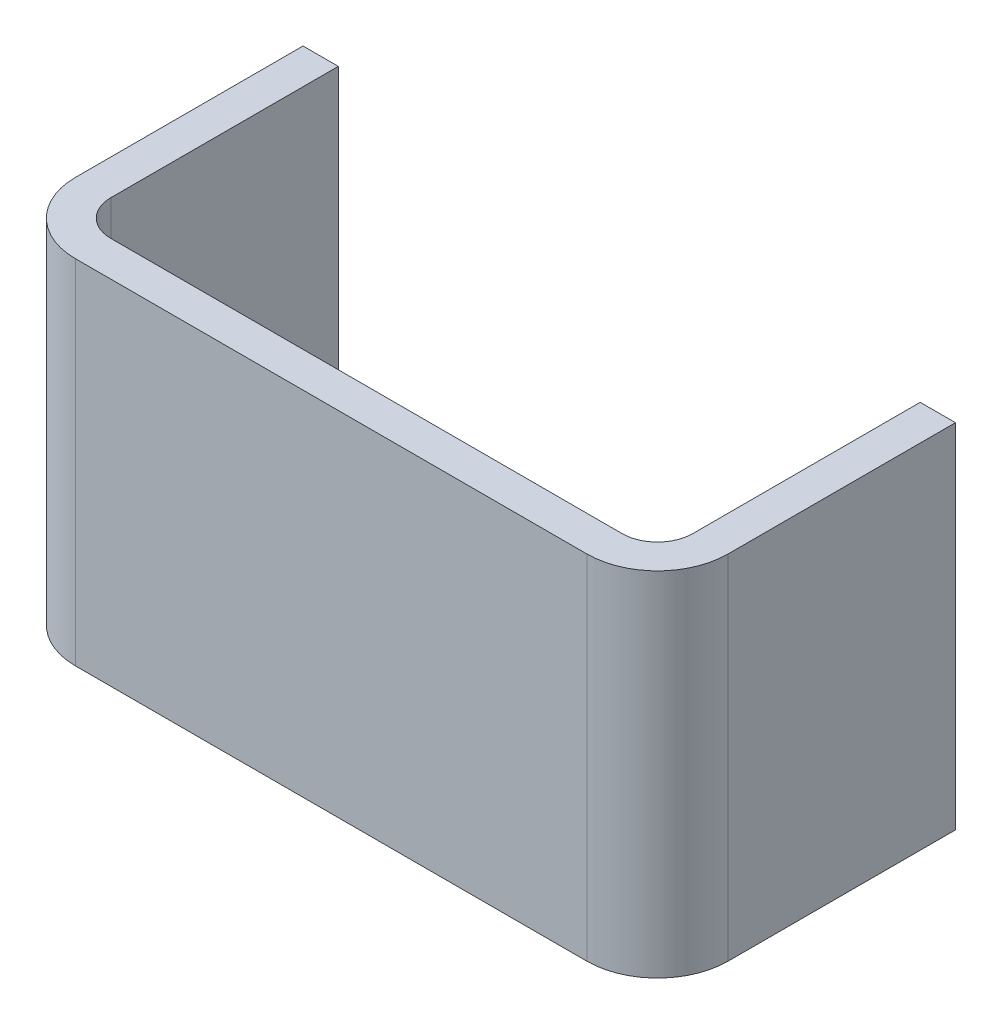
ISO-10303-21;
HEADER;
FILE_DESCRIPTION(('STEP AP214'),'2;1');
FILE_NAME('part.step','',(''),(''),'','','');
FILE_SCHEMA(('AUTOMOTIVE_DESIGN { 1 0 10303 214 1 1 1 1 }'));
ENDSEC;
DATA;
#1=APPLICATION_CONTEXT('core data for automotive mechanical design processes');
#2=APPLICATION_PROTOCOL_DEFINITION('international standard','automotive_design',2000,#1);
#3=PRODUCT_CONTEXT('',#1,'mechanical');
#4=PRODUCT('Part','Part','',(#3));
#5=PRODUCT_RELATED_PRODUCT_CATEGORY('part','',(#4));
#6=PRODUCT_DEFINITION_FORMATION('','',#4);
#7=PRODUCT_DEFINITION_CONTEXT('part definition',#1,'design');
#8=PRODUCT_DEFINITION('design','',#6,#7);
#9=PRODUCT_DEFINITION_SHAPE('','',#8);
#10=(LENGTH_UNIT() NAMED_UNIT(*) SI_UNIT(.MILLI.,.METRE.));
#11=(NAMED_UNIT(*) PLANE_ANGLE_UNIT() SI_UNIT($,.RADIAN.));
#12=(NAMED_UNIT(*) SI_UNIT($,.STERADIAN.) SOLID_ANGLE_UNIT());
#13=UNCERTAINTY_MEASURE_WITH_UNIT(LENGTH_MEASURE(1.E-05),#10,'distance_accuracy_value','');
#14=(GEOMETRIC_REPRESENTATION_CONTEXT(3) GLOBAL_UNCERTAINTY_ASSIGNED_CONTEXT((#13)) GLOBAL_UNIT_ASSIGNED_CONTEXT((#10,
#11,#12)) REPRESENTATION_CONTEXT('',''));
#15=CARTESIAN_POINT('',(0.,0.,0.));
#16=DIRECTION('',(0.,0.,1.));
#17=DIRECTION('',(1.,0.,0.));
#18=AXIS2_PLACEMENT_3D('',#15,#16,#17);
#19=CARTESIAN_POINT('',(1.36644495966095,20.,14.3944607713078));
#20=DIRECTION('',(0.,0.,1.));
#21=DIRECTION('',(1.,0.,0.));
#22=AXIS2_PLACEMENT_3D('',#19,#20,#21);
#23=PLANE('',#22);
#24=DIRECTION('',(-1.,0.,0.));
#25=VECTOR('',#24,1.);
#26=CARTESIAN_POINT('',(1.36644495966095,0.,14.3944607713078));
#27=LINE('',#26,#25);
#28=CARTESIAN_POINT('',(15.3664449596609,0.,14.3944607713078));
#29=VERTEX_POINT('',#28);
#30=CARTESIAN_POINT('',(-13.633555040339,0.,14.3944607713078));
#31=VERTEX_POINT('',#30);
#32=EDGE_CURVE('E103',#29,#31,#27,.T.);
#33=ORIENTED_EDGE('',*,*,#32,.T.);
#34=DIRECTION('',(0.,-1.,0.));
#35=VECTOR('',#34,1.);
#36=CARTESIAN_POINT('',(-13.633555040339,20.,14.3944607713078));
#37=LINE('',#36,#35);
#38=CARTESIAN_POINT('',(-13.633555040339,20.,14.3944607713078));
#39=VERTEX_POINT('',#38);
#40=EDGE_CURVE('E11',#39,#31,#37,.T.);
#41=ORIENTED_EDGE('',*,*,#40,.F.);
#42=DIRECTION('',(-1.,0.,0.));
#43=VECTOR('',#42,1.);
#44=CARTESIAN_POINT('',(1.36644495966095,20.,14.3944607713078));
#45=LINE('',#44,#43);
#46=CARTESIAN_POINT('',(15.3664449596609,20.,14.3944607713078));
#47=VERTEX_POINT('',#46);
#48=EDGE_CURVE('E109',#47,#39,#45,.T.);
#49=ORIENTED_EDGE('',*,*,#48,.F.);
#50=DIRECTION('',(0.,-1.,0.));
#51=VECTOR('',#50,1.);
#52=CARTESIAN_POINT('',(15.3664449596609,20.,14.3944607713078));
#53=LINE('',#52,#51);
#54=EDGE_CURVE('E155',#47,#29,#53,.T.);
#55=ORIENTED_EDGE('',*,*,#54,.T.);
#56=EDGE_LOOP('',(#33,#41,#49,#55));
#57=FACE_BOUND('',#56,.T.);
#58=ADVANCED_FACE('F39',(#57),#23,.F.);
#59=CARTESIAN_POINT('',(-13.6335550403391,20.,12.3944607713078));
#60=DIRECTION('',(0.,-1.,0.));
#61=DIRECTION('',(0.,0.,-1.));
#62=AXIS2_PLACEMENT_3D('',#59,#60,#61);
#63=CYLINDRICAL_SURFACE('',#62,2.);
#64=CARTESIAN_POINT('',(-13.6335550403391,0.,12.3944607713078));
#65=DIRECTION('',(0.,-1.,0.));
#66=DIRECTION('',(0.,0.,-1.));
#67=AXIS2_PLACEMENT_3D('',#64,#65,#66);
#68=CIRCLE('',#67,2.);
#69=CARTESIAN_POINT('',(-15.6335550403391,0.,12.3944607713078));
#70=VERTEX_POINT('',#69);
#71=EDGE_CURVE('E160',#31,#70,#68,.T.);
#72=ORIENTED_EDGE('',*,*,#71,.T.);
#73=DIRECTION('',(0.,-1.,0.));
#74=VECTOR('',#73,1.);
#75=CARTESIAN_POINT('',(-15.6335550403391,20.,12.3944607713078));
#76=LINE('',#75,#74);
#77=CARTESIAN_POINT('',(-15.6335550403391,20.,12.3944607713078));
#78=VERTEX_POINT('',#77);
#79=EDGE_CURVE('E47',#78,#70,#76,.T.);
#80=ORIENTED_EDGE('',*,*,#79,.F.);
#81=CARTESIAN_POINT('',(-13.6335550403391,20.,12.3944607713078));
#82=DIRECTION('',(0.,-1.,0.));
#83=DIRECTION('',(0.,0.,-1.));
#84=AXIS2_PLACEMENT_3D('',#81,#82,#83);
#85=CIRCLE('',#84,2.);
#86=EDGE_CURVE('E249',#39,#78,#85,.T.);
#87=ORIENTED_EDGE('',*,*,#86,.F.);
#88=ORIENTED_EDGE('',*,*,#40,.T.);
#89=EDGE_LOOP('',(#72,#80,#87,#88));
#90=FACE_BOUND('',#89,.T.);
#91=ADVANCED_FACE('F252',(#90),#63,.F.);
#92=CARTESIAN_POINT('',(-15.6335550403391,20.,12.3944607713078));
#93=DIRECTION('',(-1.,0.,0.));
#94=DIRECTION('',(0.,0.,1.));
#95=AXIS2_PLACEMENT_3D('',#92,#93,#94);
#96=PLANE('',#95);
#97=DIRECTION('',(0.,0.,-1.));
#98=VECTOR('',#97,1.);
#99=CARTESIAN_POINT('',(-15.6335550403391,0.,12.3944607713078));
#100=LINE('',#99,#98);
#101=CARTESIAN_POINT('',(-15.6335550403391,0.,-0.505539228692196));
#102=VERTEX_POINT('',#101);
#103=EDGE_CURVE('E162',#70,#102,#100,.T.);
#104=ORIENTED_EDGE('',*,*,#103,.T.);
#105=DIRECTION('',(0.,-1.,0.));
#106=VECTOR('',#105,1.);
#107=CARTESIAN_POINT('',(-15.6335550403391,20.,-0.505539228692196));
#108=LINE('',#107,#106);
#109=CARTESIAN_POINT('',(-15.6335550403391,20.,-0.505539228692196));
#110=VERTEX_POINT('',#109);
#111=EDGE_CURVE('E200',#110,#102,#108,.T.);
#112=ORIENTED_EDGE('',*,*,#111,.F.);
#113=DIRECTION('',(0.,0.,-1.));
#114=VECTOR('',#113,1.);
#115=CARTESIAN_POINT('',(-15.6335550403391,20.,12.3944607713078));
#116=LINE('',#115,#114);
#117=EDGE_CURVE('E209',#78,#110,#116,.T.);
#118=ORIENTED_EDGE('',*,*,#117,.F.);
#119=ORIENTED_EDGE('',*,*,#79,.T.);
#120=EDGE_LOOP('',(#104,#112,#118,#119));
#121=FACE_BOUND('',#120,.T.);
#122=ADVANCED_FACE('F207',(#121),#96,.F.);
#123=CARTESIAN_POINT('',(-17.6335550403391,20.,-0.505539228692196));
#124=DIRECTION('',(0.,0.,1.));
#125=DIRECTION('',(1.,0.,0.));
#126=AXIS2_PLACEMENT_3D('',#123,#124,#125);
#127=PLANE('',#126);
#128=DIRECTION('',(-1.,0.,0.));
#129=VECTOR('',#128,1.);
#130=CARTESIAN_POINT('',(-17.6335550403391,0.,-0.505539228692196));
#131=LINE('',#130,#129);
#132=CARTESIAN_POINT('',(-17.6335550403391,0.,-0.505539228692196));
#133=VERTEX_POINT('',#132);
#134=EDGE_CURVE('E164',#102,#133,#131,.T.);
#135=ORIENTED_EDGE('',*,*,#134,.T.);
#136=DIRECTION('',(0.,-1.,0.));
#137=VECTOR('',#136,1.);
#138=CARTESIAN_POINT('',(-17.6335550403391,20.,-0.505539228692196));
#139=LINE('',#138,#137);
#140=CARTESIAN_POINT('',(-17.6335550403391,20.,-0.505539228692196));
#141=VERTEX_POINT('',#140);
#142=EDGE_CURVE('E197',#141,#133,#139,.T.);
#143=ORIENTED_EDGE('',*,*,#142,.F.);
#144=DIRECTION('',(-1.,0.,0.));
#145=VECTOR('',#144,1.);
#146=CARTESIAN_POINT('',(-17.6335550403391,20.,-0.505539228692196));
#147=LINE('',#146,#145);
#148=EDGE_CURVE('E227',#110,#141,#147,.T.);
#149=ORIENTED_EDGE('',*,*,#148,.F.);
#150=ORIENTED_EDGE('',*,*,#111,.T.);
#151=EDGE_LOOP('',(#135,#143,#149,#150));
#152=FACE_BOUND('',#151,.T.);
#153=ADVANCED_FACE('F218',(#152),#127,.F.);
#154=CARTESIAN_POINT('',(-17.6335550403391,20.,12.3944607713078));
#155=DIRECTION('',(1.,0.,0.));
#156=DIRECTION('',(0.,0.,-1.));
#157=AXIS2_PLACEMENT_3D('',#154,#155,#156);
#158=PLANE('',#157);
#159=DIRECTION('',(0.,0.,1.));
#160=VECTOR('',#159,1.);
#161=CARTESIAN_POINT('',(-17.6335550403391,0.,12.3944607713078));
#162=LINE('',#161,#160);
#163=CARTESIAN_POINT('',(-17.6335550403391,0.,12.3944607713078));
#164=VERTEX_POINT('',#163);
#165=EDGE_CURVE('E166',#133,#164,#162,.T.);
#166=ORIENTED_EDGE('',*,*,#165,.T.);
#167=DIRECTION('',(0.,-1.,0.));
#168=VECTOR('',#167,1.);
#169=CARTESIAN_POINT('',(-17.6335550403391,20.,12.3944607713078));
#170=LINE('',#169,#168);
#171=CARTESIAN_POINT('',(-17.6335550403391,20.,12.3944607713078));
#172=VERTEX_POINT('',#171);
#173=EDGE_CURVE('E194',#172,#164,#170,.T.);
#174=ORIENTED_EDGE('',*,*,#173,.F.);
#175=DIRECTION('',(0.,0.,1.));
#176=VECTOR('',#175,1.);
#177=CARTESIAN_POINT('',(-17.6335550403391,20.,12.3944607713078));
#178=LINE('',#177,#176);
#179=EDGE_CURVE('E224',#141,#172,#178,.T.);
#180=ORIENTED_EDGE('',*,*,#179,.F.);
#181=ORIENTED_EDGE('',*,*,#142,.T.);
#182=EDGE_LOOP('',(#166,#174,#180,#181));
#183=FACE_BOUND('',#182,.T.);
#184=ADVANCED_FACE('F222',(#183),#158,.F.);
#185=CARTESIAN_POINT('',(-13.6335550403391,20.,12.3944607713078));
#186=DIRECTION('',(0.,-1.,0.));
#187=DIRECTION('',(0.,0.,-1.));
#188=AXIS2_PLACEMENT_3D('',#185,#186,#187);
#189=CYLINDRICAL_SURFACE('',#188,4.);
#190=CARTESIAN_POINT('',(-13.6335550403391,0.,12.3944607713078));
#191=DIRECTION('',(0.,1.,0.));
#192=DIRECTION('',(0.,0.,-1.));
#193=AXIS2_PLACEMENT_3D('',#190,#191,#192);
#194=CIRCLE('',#193,4.);
#195=CARTESIAN_POINT('',(-13.633555040339,0.,16.3944607713078));
#196=VERTEX_POINT('',#195);
#197=EDGE_CURVE('E168',#164,#196,#194,.T.);
#198=ORIENTED_EDGE('',*,*,#197,.T.);
#199=DIRECTION('',(0.,-1.,0.));
#200=VECTOR('',#199,1.);
#201=CARTESIAN_POINT('',(-13.633555040339,20.,16.3944607713078));
#202=LINE('',#201,#200);
#203=CARTESIAN_POINT('',(-13.633555040339,20.,16.3944607713078));
#204=VERTEX_POINT('',#203);
#205=EDGE_CURVE('E191',#204,#196,#202,.T.);
#206=ORIENTED_EDGE('',*,*,#205,.F.);
#207=CARTESIAN_POINT('',(-13.6335550403391,20.,12.3944607713078));
#208=DIRECTION('',(0.,1.,0.));
#209=DIRECTION('',(0.,0.,-1.));
#210=AXIS2_PLACEMENT_3D('',#207,#208,#209);
#211=CIRCLE('',#210,4.);
#212=EDGE_CURVE('E226',#172,#204,#211,.T.);
#213=ORIENTED_EDGE('',*,*,#212,.F.);
#214=ORIENTED_EDGE('',*,*,#173,.T.);
#215=EDGE_LOOP('',(#198,#206,#213,#214));
#216=FACE_BOUND('',#215,.T.);
#217=ADVANCED_FACE('F264',(#216),#189,.T.);
#218=CARTESIAN_POINT('',(1.36644495966095,20.,16.3944607713078));
#219=DIRECTION('',(0.,0.,-1.));
#220=DIRECTION('',(-1.,0.,0.));
#221=AXIS2_PLACEMENT_3D('',#218,#219,#220);
#222=PLANE('',#221);
#223=DIRECTION('',(1.,0.,0.));
#224=VECTOR('',#223,1.);
#225=CARTESIAN_POINT('',(1.36644495966095,0.,16.3944607713078));
#226=LINE('',#225,#224);
#227=CARTESIAN_POINT('',(15.3664449596609,0.,16.3944607713078));
#228=VERTEX_POINT('',#227);
#229=EDGE_CURVE('E171',#196,#228,#226,.T.);
#230=ORIENTED_EDGE('',*,*,#229,.T.);
#231=DIRECTION('',(0.,-1.,0.));
#232=VECTOR('',#231,1.);
#233=CARTESIAN_POINT('',(15.3664449596609,20.,16.3944607713078));
#234=LINE('',#233,#232);
#235=CARTESIAN_POINT('',(15.3664449596609,20.,16.3944607713078));
#236=VERTEX_POINT('',#235);
#237=EDGE_CURVE('E188',#236,#228,#234,.T.);
#238=ORIENTED_EDGE('',*,*,#237,.F.);
#239=DIRECTION('',(1.,0.,0.));
#240=VECTOR('',#239,1.);
#241=CARTESIAN_POINT('',(1.36644495966095,20.,16.3944607713078));
#242=LINE('',#241,#240);
#243=EDGE_CURVE('E229',#204,#236,#242,.T.);
#244=ORIENTED_EDGE('',*,*,#243,.F.);
#245=ORIENTED_EDGE('',*,*,#205,.T.);
#246=EDGE_LOOP('',(#230,#238,#244,#245));
#247=FACE_BOUND('',#246,.T.);
#248=ADVANCED_FACE('F267',(#247),#222,.F.);
#249=CARTESIAN_POINT('',(15.3664449596609,20.,12.3944607713078));
#250=DIRECTION('',(0.,-1.,0.));
#251=DIRECTION('',(0.,0.,-1.));
#252=AXIS2_PLACEMENT_3D('',#249,#250,#251);
#253=CYLINDRICAL_SURFACE('',#252,4.);
#254=CARTESIAN_POINT('',(15.3664449596609,0.,12.3944607713078));
#255=DIRECTION('',(0.,1.,0.));
#256=DIRECTION('',(0.,0.,-1.));
#257=AXIS2_PLACEMENT_3D('',#254,#255,#256);
#258=CIRCLE('',#257,4.);
#259=CARTESIAN_POINT('',(19.366444959661,0.,12.3944607713078));
#260=VERTEX_POINT('',#259);
#261=EDGE_CURVE('E173',#228,#260,#258,.T.);
#262=ORIENTED_EDGE('',*,*,#261,.T.);
#263=DIRECTION('',(0.,-1.,0.));
#264=VECTOR('',#263,1.);
#265=CARTESIAN_POINT('',(19.366444959661,20.,12.3944607713078));
#266=LINE('',#265,#264);
#267=CARTESIAN_POINT('',(19.366444959661,20.,12.3944607713078));
#268=VERTEX_POINT('',#267);
#269=EDGE_CURVE('E185',#268,#260,#266,.T.);
#270=ORIENTED_EDGE('',*,*,#269,.F.);
#271=CARTESIAN_POINT('',(15.3664449596609,20.,12.3944607713078));
#272=DIRECTION('',(0.,1.,0.));
#273=DIRECTION('',(0.,0.,-1.));
#274=AXIS2_PLACEMENT_3D('',#271,#272,#273);
#275=CIRCLE('',#274,4.);
#276=EDGE_CURVE('E235',#236,#268,#275,.T.);
#277=ORIENTED_EDGE('',*,*,#276,.F.);
#278=ORIENTED_EDGE('',*,*,#237,.T.);
#279=EDGE_LOOP('',(#262,#270,#277,#278));
#280=FACE_BOUND('',#279,.T.);
#281=ADVANCED_FACE('F241',(#280),#253,.T.);
#282=CARTESIAN_POINT('',(19.366444959661,20.,12.3944607713078));
#283=DIRECTION('',(-1.,0.,0.));
#284=DIRECTION('',(0.,0.,1.));
#285=AXIS2_PLACEMENT_3D('',#282,#283,#284);
#286=PLANE('',#285);
#287=DIRECTION('',(0.,0.,-1.));
#288=VECTOR('',#287,1.);
#289=CARTESIAN_POINT('',(19.366444959661,0.,12.3944607713078));
#290=LINE('',#289,#288);
#291=CARTESIAN_POINT('',(19.366444959661,0.,-0.505539228692196));
#292=VERTEX_POINT('',#291);
#293=EDGE_CURVE('E175',#260,#292,#290,.T.);
#294=ORIENTED_EDGE('',*,*,#293,.T.);
#295=DIRECTION('',(0.,-1.,0.));
#296=VECTOR('',#295,1.);
#297=CARTESIAN_POINT('',(19.366444959661,20.,-0.505539228692196));
#298=LINE('',#297,#296);
#299=CARTESIAN_POINT('',(19.366444959661,20.,-0.505539228692196));
#300=VERTEX_POINT('',#299);
#301=EDGE_CURVE('E150',#300,#292,#298,.T.);
#302=ORIENTED_EDGE('',*,*,#301,.F.);
#303=DIRECTION('',(0.,0.,-1.));
#304=VECTOR('',#303,1.);
#305=CARTESIAN_POINT('',(19.366444959661,20.,12.3944607713078));
#306=LINE('',#305,#304);
#307=EDGE_CURVE('E141',#268,#300,#306,.T.);
#308=ORIENTED_EDGE('',*,*,#307,.F.);
#309=ORIENTED_EDGE('',*,*,#269,.T.);
#310=EDGE_LOOP('',(#294,#302,#308,#309));
#311=FACE_BOUND('',#310,.T.);
#312=ADVANCED_FACE('F245',(#311),#286,.F.);
#313=CARTESIAN_POINT('',(17.3664449596609,20.,-0.505539228692196));
#314=DIRECTION('',(0.,0.,1.));
#315=DIRECTION('',(1.,0.,0.));
#316=AXIS2_PLACEMENT_3D('',#313,#314,#315);
#317=PLANE('',#316);
#318=DIRECTION('',(-1.,0.,0.));
#319=VECTOR('',#318,1.);
#320=CARTESIAN_POINT('',(17.3664449596609,0.,-0.505539228692196));
#321=LINE('',#320,#319);
#322=CARTESIAN_POINT('',(17.3664449596609,0.,-0.505539228692196));
#323=VERTEX_POINT('',#322);
#324=EDGE_CURVE('E149',#292,#323,#321,.T.);
#325=ORIENTED_EDGE('',*,*,#324,.T.);
#326=DIRECTION('',(0.,-1.,0.));
#327=VECTOR('',#326,1.);
#328=CARTESIAN_POINT('',(17.3664449596609,20.,-0.505539228692196));
#329=LINE('',#328,#327);
#330=CARTESIAN_POINT('',(17.3664449596609,20.,-0.505539228692196));
#331=VERTEX_POINT('',#330);
#332=EDGE_CURVE('E146',#331,#323,#329,.T.);
#333=ORIENTED_EDGE('',*,*,#332,.F.);
#334=DIRECTION('',(-1.,0.,0.));
#335=VECTOR('',#334,1.);
#336=CARTESIAN_POINT('',(17.3664449596609,20.,-0.505539228692196));
#337=LINE('',#336,#335);
#338=EDGE_CURVE('E135',#300,#331,#337,.T.);
#339=ORIENTED_EDGE('',*,*,#338,.F.);
#340=ORIENTED_EDGE('',*,*,#301,.T.);
#341=EDGE_LOOP('',(#325,#333,#339,#340));
#342=FACE_BOUND('',#341,.T.);
#343=ADVANCED_FACE('F147',(#342),#317,.F.);
#344=CARTESIAN_POINT('',(17.3664449596609,20.,12.3944607713078));
#345=DIRECTION('',(1.,0.,0.));
#346=DIRECTION('',(0.,0.,-1.));
#347=AXIS2_PLACEMENT_3D('',#344,#345,#346);
#348=PLANE('',#347);
#349=DIRECTION('',(0.,0.,1.));
#350=VECTOR('',#349,1.);
#351=CARTESIAN_POINT('',(17.3664449596609,0.,12.3944607713078));
#352=LINE('',#351,#350);
#353=CARTESIAN_POINT('',(17.3664449596609,0.,12.3944607713078));
#354=VERTEX_POINT('',#353);
#355=EDGE_CURVE('E96',#323,#354,#352,.T.);
#356=ORIENTED_EDGE('',*,*,#355,.T.);
#357=DIRECTION('',(0.,-1.,0.));
#358=VECTOR('',#357,1.);
#359=CARTESIAN_POINT('',(17.3664449596609,20.,12.3944607713078));
#360=LINE('',#359,#358);
#361=CARTESIAN_POINT('',(17.3664449596609,20.,12.3944607713078));
#362=VERTEX_POINT('',#361);
#363=EDGE_CURVE('E151',#362,#354,#360,.T.);
#364=ORIENTED_EDGE('',*,*,#363,.F.);
#365=DIRECTION('',(0.,0.,1.));
#366=VECTOR('',#365,1.);
#367=CARTESIAN_POINT('',(17.3664449596609,20.,12.3944607713078));
#368=LINE('',#367,#366);
#369=EDGE_CURVE('E139',#331,#362,#368,.T.);
#370=ORIENTED_EDGE('',*,*,#369,.F.);
#371=ORIENTED_EDGE('',*,*,#332,.T.);
#372=EDGE_LOOP('',(#356,#364,#370,#371));
#373=FACE_BOUND('',#372,.T.);
#374=ADVANCED_FACE('F153',(#373),#348,.F.);
#375=CARTESIAN_POINT('',(15.3664449596609,20.,12.3944607713078));
#376=DIRECTION('',(0.,-1.,0.));
#377=DIRECTION('',(0.,0.,-1.));
#378=AXIS2_PLACEMENT_3D('',#375,#376,#377);
#379=CYLINDRICAL_SURFACE('',#378,2.);
#380=CARTESIAN_POINT('',(15.3664449596609,0.,12.3944607713078));
#381=DIRECTION('',(0.,-1.,0.));
#382=DIRECTION('',(0.,0.,-1.));
#383=AXIS2_PLACEMENT_3D('',#380,#381,#382);
#384=CIRCLE('',#383,2.);
#385=EDGE_CURVE('E179',#354,#29,#384,.T.);
#386=ORIENTED_EDGE('',*,*,#385,.T.);
#387=ORIENTED_EDGE('',*,*,#54,.F.);
#388=CARTESIAN_POINT('',(15.3664449596609,20.,12.3944607713078));
#389=DIRECTION('',(0.,-1.,0.));
#390=DIRECTION('',(0.,0.,-1.));
#391=AXIS2_PLACEMENT_3D('',#388,#389,#390);
#392=CIRCLE('',#391,2.);
#393=EDGE_CURVE('E55',#362,#47,#392,.T.);
#394=ORIENTED_EDGE('',*,*,#393,.F.);
#395=ORIENTED_EDGE('',*,*,#363,.T.);
#396=EDGE_LOOP('',(#386,#387,#394,#395));
#397=FACE_BOUND('',#396,.T.);
#398=ADVANCED_FACE('F247',(#397),#379,.F.);
#399=CARTESIAN_POINT('',(15.3664449596609,20.,12.3944607713078));
#400=DIRECTION('',(0.,-1.,0.));
#401=DIRECTION('',(0.,0.,-1.));
#402=AXIS2_PLACEMENT_3D('',#399,#400,#401);
#403=PLANE('',#402);
#404=ORIENTED_EDGE('',*,*,#48,.T.);
#405=ORIENTED_EDGE('',*,*,#86,.T.);
#406=ORIENTED_EDGE('',*,*,#117,.T.);
#407=ORIENTED_EDGE('',*,*,#148,.T.);
#408=ORIENTED_EDGE('',*,*,#179,.T.);
#409=ORIENTED_EDGE('',*,*,#212,.T.);
#410=ORIENTED_EDGE('',*,*,#243,.T.);
#411=ORIENTED_EDGE('',*,*,#276,.T.);
#412=ORIENTED_EDGE('',*,*,#307,.T.);
#413=ORIENTED_EDGE('',*,*,#338,.T.);
#414=ORIENTED_EDGE('',*,*,#369,.T.);
#415=ORIENTED_EDGE('',*,*,#393,.T.);
#416=EDGE_LOOP('',(#404,#405,#406,#407,#408,#409,#410,#411,#412,#413,#414,#415));
#417=FACE_BOUND('',#416,.T.);
#418=ADVANCED_FACE('F137',(#417),#403,.F.);
#419=CARTESIAN_POINT('',(15.3664449596609,0.,12.3944607713078));
#420=DIRECTION('',(0.,-1.,0.));
#421=DIRECTION('',(0.,0.,-1.));
#422=AXIS2_PLACEMENT_3D('',#419,#420,#421);
#423=PLANE('',#422);
#424=ORIENTED_EDGE('',*,*,#32,.F.);
#425=ORIENTED_EDGE('',*,*,#385,.F.);
#426=ORIENTED_EDGE('',*,*,#355,.F.);
#427=ORIENTED_EDGE('',*,*,#324,.F.);
#428=ORIENTED_EDGE('',*,*,#293,.F.);
#429=ORIENTED_EDGE('',*,*,#261,.F.);
#430=ORIENTED_EDGE('',*,*,#229,.F.);
#431=ORIENTED_EDGE('',*,*,#197,.F.);
#432=ORIENTED_EDGE('',*,*,#165,.F.);
#433=ORIENTED_EDGE('',*,*,#134,.F.);
#434=ORIENTED_EDGE('',*,*,#103,.F.);
#435=ORIENTED_EDGE('',*,*,#71,.F.);
#436=EDGE_LOOP('',(#424,#425,#426,#427,#428,#429,#430,#431,#432,#433,#434,#435));
#437=FACE_BOUND('',#436,.T.);
#438=ADVANCED_FACE('F213',(#437),#423,.T.);
#439=CLOSED_SHELL('',(#58,#91,#122,#153,#184,#217,#248,#281,#312,#343,#374,#398,#418,#438));
#440=MANIFOLD_SOLID_BREP('B2',#439);
#441=ADVANCED_BREP_SHAPE_REPRESENTATION('',(#18,#440),#14);
#442=SHAPE_DEFINITION_REPRESENTATION(#9,#441);
ENDSEC;
END-ISO-10303-21;
